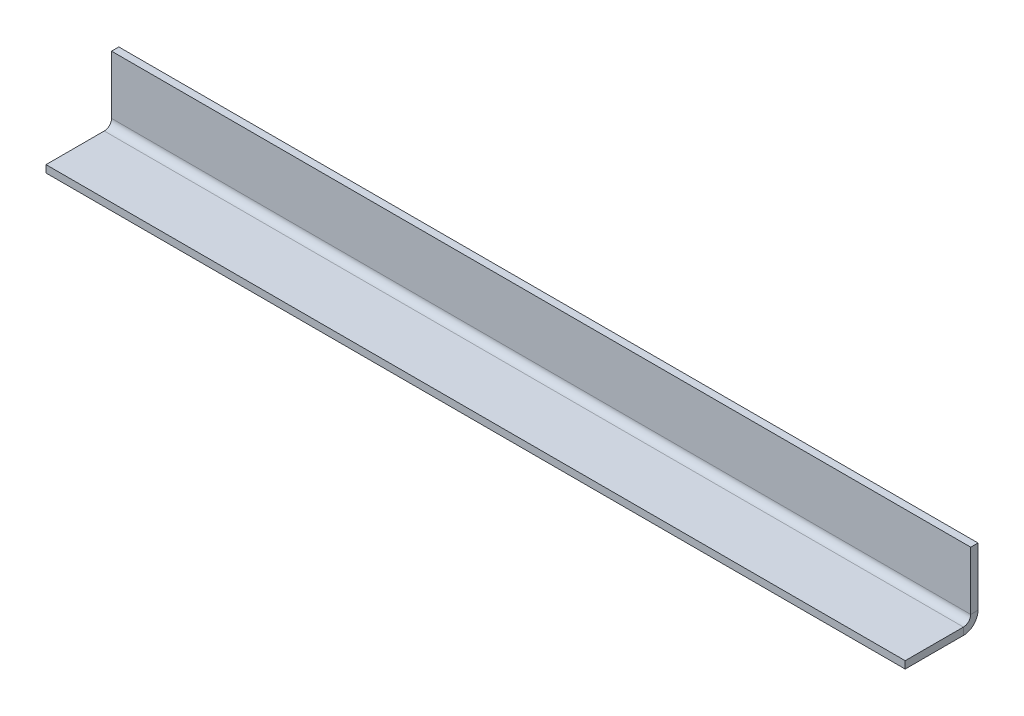
ISO-10303-21;
HEADER;
FILE_DESCRIPTION(('STEP AP214'),'2;1');
FILE_NAME('part.step','',(''),(''),'','','');
FILE_SCHEMA(('AUTOMOTIVE_DESIGN { 1 0 10303 214 1 1 1 1 }'));
ENDSEC;
DATA;
#1=APPLICATION_CONTEXT('core data for automotive mechanical design processes');
#2=APPLICATION_PROTOCOL_DEFINITION('international standard','automotive_design',2000,#1);
#3=PRODUCT_CONTEXT('',#1,'mechanical');
#4=PRODUCT('Part','Part','',(#3));
#5=PRODUCT_RELATED_PRODUCT_CATEGORY('part','',(#4));
#6=PRODUCT_DEFINITION_FORMATION('','',#4);
#7=PRODUCT_DEFINITION_CONTEXT('part definition',#1,'design');
#8=PRODUCT_DEFINITION('design','',#6,#7);
#9=PRODUCT_DEFINITION_SHAPE('','',#8);
#10=(LENGTH_UNIT() NAMED_UNIT(*) SI_UNIT(.MILLI.,.METRE.));
#11=(NAMED_UNIT(*) PLANE_ANGLE_UNIT() SI_UNIT($,.RADIAN.));
#12=(NAMED_UNIT(*) SI_UNIT($,.STERADIAN.) SOLID_ANGLE_UNIT());
#13=UNCERTAINTY_MEASURE_WITH_UNIT(LENGTH_MEASURE(1.E-05),#10,'distance_accuracy_value','');
#14=(GEOMETRIC_REPRESENTATION_CONTEXT(3) GLOBAL_UNCERTAINTY_ASSIGNED_CONTEXT((#13)) GLOBAL_UNIT_ASSIGNED_CONTEXT((#10,
#11,#12)) REPRESENTATION_CONTEXT('',''));
#15=CARTESIAN_POINT('',(0.,0.,0.));
#16=DIRECTION('',(0.,0.,1.));
#17=DIRECTION('',(1.,0.,0.));
#18=AXIS2_PLACEMENT_3D('',#15,#16,#17);
#19=CARTESIAN_POINT('',(374.65,0.,-25.4));
#20=DIRECTION('',(1.,0.,0.));
#21=DIRECTION('',(0.,0.,-1.));
#22=AXIS2_PLACEMENT_3D('',#19,#20,#21);
#23=PLANE('',#22);
#24=DIRECTION('',(0.,1.,0.));
#25=VECTOR('',#24,1.);
#26=CARTESIAN_POINT('',(374.65,0.,-25.4));
#27=LINE('',#26,#25);
#28=CARTESIAN_POINT('',(374.65,0.,-25.4));
#29=VERTEX_POINT('',#28);
#30=CARTESIAN_POINT('',(374.65,3.175,-25.4));
#31=VERTEX_POINT('',#30);
#32=EDGE_CURVE('E11',#29,#31,#27,.T.);
#33=ORIENTED_EDGE('',*,*,#32,.F.);
#34=CARTESIAN_POINT('',(374.65,6.35,-25.4));
#35=DIRECTION('',(-1.,0.,0.));
#36=DIRECTION('',(0.,0.,1.));
#37=AXIS2_PLACEMENT_3D('',#34,#35,#36);
#38=CIRCLE('',#37,6.35);
#39=CARTESIAN_POINT('',(374.65,6.35,-31.75));
#40=VERTEX_POINT('',#39);
#41=EDGE_CURVE('E127',#29,#40,#38,.F.);
#42=ORIENTED_EDGE('',*,*,#41,.T.);
#43=DIRECTION('',(0.,0.,-1.));
#44=VECTOR('',#43,1.);
#45=CARTESIAN_POINT('',(374.65,6.35,-28.575));
#46=LINE('',#45,#44);
#47=CARTESIAN_POINT('',(374.65,6.35,-28.575));
#48=VERTEX_POINT('',#47);
#49=EDGE_CURVE('E45',#48,#40,#46,.T.);
#50=ORIENTED_EDGE('',*,*,#49,.F.);
#51=CARTESIAN_POINT('',(374.65,6.35,-25.4));
#52=DIRECTION('',(1.,0.,0.));
#53=DIRECTION('',(0.,0.,-1.));
#54=AXIS2_PLACEMENT_3D('',#51,#52,#53);
#55=CIRCLE('',#54,3.175);
#56=EDGE_CURVE('E134',#31,#48,#55,.T.);
#57=ORIENTED_EDGE('',*,*,#56,.F.);
#58=EDGE_LOOP('',(#33,#42,#50,#57));
#59=FACE_BOUND('',#58,.T.);
#60=ADVANCED_FACE('F37',(#59),#23,.T.);
#61=CARTESIAN_POINT('',(374.65,6.35,-28.575));
#62=DIRECTION('',(1.,0.,0.));
#63=DIRECTION('',(0.,0.,-1.));
#64=AXIS2_PLACEMENT_3D('',#61,#62,#63);
#65=PLANE('',#64);
#66=DIRECTION('',(0.,0.,-1.));
#67=VECTOR('',#66,1.);
#68=CARTESIAN_POINT('',(374.65,0.,0.));
#69=LINE('',#68,#67);
#70=CARTESIAN_POINT('',(374.65,0.,0.));
#71=VERTEX_POINT('',#70);
#72=EDGE_CURVE('E122',#71,#29,#69,.T.);
#73=ORIENTED_EDGE('',*,*,#72,.T.);
#74=ORIENTED_EDGE('',*,*,#32,.T.);
#75=DIRECTION('',(0.,0.,-1.));
#76=VECTOR('',#75,1.);
#77=CARTESIAN_POINT('',(374.65,3.175,0.));
#78=LINE('',#77,#76);
#79=CARTESIAN_POINT('',(374.65,3.175,0.));
#80=VERTEX_POINT('',#79);
#81=EDGE_CURVE('E132',#80,#31,#78,.T.);
#82=ORIENTED_EDGE('',*,*,#81,.F.);
#83=DIRECTION('',(0.,1.,0.));
#84=VECTOR('',#83,1.);
#85=CARTESIAN_POINT('',(374.65,0.,0.));
#86=LINE('',#85,#84);
#87=EDGE_CURVE('E113',#71,#80,#86,.T.);
#88=ORIENTED_EDGE('',*,*,#87,.F.);
#89=EDGE_LOOP('',(#73,#74,#82,#88));
#90=FACE_BOUND('',#89,.T.);
#91=ADVANCED_FACE('F130',(#90),#65,.T.);
#92=CARTESIAN_POINT('',(0.,6.35,-31.75));
#93=DIRECTION('',(-1.,0.,0.));
#94=DIRECTION('',(0.,0.,1.));
#95=AXIS2_PLACEMENT_3D('',#92,#93,#94);
#96=PLANE('',#95);
#97=DIRECTION('',(0.,0.,1.));
#98=VECTOR('',#97,1.);
#99=CARTESIAN_POINT('',(0.,6.35,-31.75));
#100=LINE('',#99,#98);
#101=CARTESIAN_POINT('',(0.,6.35,-31.75));
#102=VERTEX_POINT('',#101);
#103=CARTESIAN_POINT('',(0.,6.35,-28.575));
#104=VERTEX_POINT('',#103);
#105=EDGE_CURVE('E88',#102,#104,#100,.T.);
#106=ORIENTED_EDGE('',*,*,#105,.F.);
#107=CARTESIAN_POINT('',(0.,6.35,-25.4));
#108=DIRECTION('',(-1.,0.,0.));
#109=DIRECTION('',(0.,0.,1.));
#110=AXIS2_PLACEMENT_3D('',#107,#108,#109);
#111=CIRCLE('',#110,6.35);
#112=CARTESIAN_POINT('',(0.,0.,-25.4));
#113=VERTEX_POINT('',#112);
#114=EDGE_CURVE('E156',#113,#102,#111,.F.);
#115=ORIENTED_EDGE('',*,*,#114,.F.);
#116=DIRECTION('',(0.,-1.,0.));
#117=VECTOR('',#116,1.);
#118=CARTESIAN_POINT('',(0.,3.175,-25.4));
#119=LINE('',#118,#117);
#120=CARTESIAN_POINT('',(0.,3.175,-25.4));
#121=VERTEX_POINT('',#120);
#122=EDGE_CURVE('E81',#121,#113,#119,.T.);
#123=ORIENTED_EDGE('',*,*,#122,.F.);
#124=CARTESIAN_POINT('',(0.,6.35,-25.4));
#125=DIRECTION('',(1.,0.,0.));
#126=DIRECTION('',(0.,0.,-1.));
#127=AXIS2_PLACEMENT_3D('',#124,#125,#126);
#128=CIRCLE('',#127,3.175);
#129=EDGE_CURVE('E149',#121,#104,#128,.T.);
#130=ORIENTED_EDGE('',*,*,#129,.T.);
#131=EDGE_LOOP('',(#106,#115,#123,#130));
#132=FACE_BOUND('',#131,.T.);
#133=ADVANCED_FACE('F188',(#132),#96,.T.);
#134=CARTESIAN_POINT('',(0.,3.175,-25.4));
#135=DIRECTION('',(-1.,0.,0.));
#136=DIRECTION('',(0.,0.,1.));
#137=AXIS2_PLACEMENT_3D('',#134,#135,#136);
#138=PLANE('',#137);
#139=DIRECTION('',(0.,1.,0.));
#140=VECTOR('',#139,1.);
#141=CARTESIAN_POINT('',(0.,0.,-31.75));
#142=LINE('',#141,#140);
#143=CARTESIAN_POINT('',(0.,31.75,-31.75));
#144=VERTEX_POINT('',#143);
#145=EDGE_CURVE('E140',#102,#144,#142,.T.);
#146=ORIENTED_EDGE('',*,*,#145,.F.);
#147=ORIENTED_EDGE('',*,*,#105,.T.);
#148=DIRECTION('',(0.,1.,0.));
#149=VECTOR('',#148,1.);
#150=CARTESIAN_POINT('',(0.,0.,-28.575));
#151=LINE('',#150,#149);
#152=CARTESIAN_POINT('',(0.,31.75,-28.575));
#153=VERTEX_POINT('',#152);
#154=EDGE_CURVE('E146',#104,#153,#151,.T.);
#155=ORIENTED_EDGE('',*,*,#154,.T.);
#156=DIRECTION('',(0.,0.,-1.));
#157=VECTOR('',#156,1.);
#158=CARTESIAN_POINT('',(0.,31.75,-28.575));
#159=LINE('',#158,#157);
#160=EDGE_CURVE('E143',#153,#144,#159,.T.);
#161=ORIENTED_EDGE('',*,*,#160,.T.);
#162=EDGE_LOOP('',(#146,#147,#155,#161));
#163=FACE_BOUND('',#162,.T.);
#164=ADVANCED_FACE('F175',(#163),#138,.T.);
#165=CARTESIAN_POINT('',(374.65,0.,-31.75));
#166=DIRECTION('',(0.,0.,1.));
#167=DIRECTION('',(1.,0.,0.));
#168=AXIS2_PLACEMENT_3D('',#165,#166,#167);
#169=PLANE('',#168);
#170=ORIENTED_EDGE('',*,*,#145,.T.);
#171=DIRECTION('',(-1.,0.,0.));
#172=VECTOR('',#171,1.);
#173=CARTESIAN_POINT('',(374.65,31.75,-31.75));
#174=LINE('',#173,#172);
#175=CARTESIAN_POINT('',(374.65,31.75,-31.75));
#176=VERTEX_POINT('',#175);
#177=EDGE_CURVE('E170',#176,#144,#174,.T.);
#178=ORIENTED_EDGE('',*,*,#177,.F.);
#179=DIRECTION('',(0.,1.,0.));
#180=VECTOR('',#179,1.);
#181=CARTESIAN_POINT('',(374.65,0.,-31.75));
#182=LINE('',#181,#180);
#183=EDGE_CURVE('E94',#40,#176,#182,.T.);
#184=ORIENTED_EDGE('',*,*,#183,.F.);
#185=DIRECTION('',(-1.,0.,0.));
#186=VECTOR('',#185,1.);
#187=CARTESIAN_POINT('',(374.65,6.35,-31.75));
#188=LINE('',#187,#186);
#189=EDGE_CURVE('E139',#40,#102,#188,.T.);
#190=ORIENTED_EDGE('',*,*,#189,.T.);
#191=EDGE_LOOP('',(#170,#178,#184,#190));
#192=FACE_BOUND('',#191,.T.);
#193=ADVANCED_FACE('F224',(#192),#169,.F.);
#194=CARTESIAN_POINT('',(374.65,31.75,-28.575));
#195=DIRECTION('',(0.,1.,0.));
#196=DIRECTION('',(0.,0.,1.));
#197=AXIS2_PLACEMENT_3D('',#194,#195,#196);
#198=PLANE('',#197);
#199=ORIENTED_EDGE('',*,*,#160,.F.);
#200=DIRECTION('',(-1.,0.,0.));
#201=VECTOR('',#200,1.);
#202=CARTESIAN_POINT('',(374.65,31.75,-28.575));
#203=LINE('',#202,#201);
#204=CARTESIAN_POINT('',(374.65,31.75,-28.575));
#205=VERTEX_POINT('',#204);
#206=EDGE_CURVE('E168',#205,#153,#203,.T.);
#207=ORIENTED_EDGE('',*,*,#206,.F.);
#208=DIRECTION('',(0.,0.,-1.));
#209=VECTOR('',#208,1.);
#210=CARTESIAN_POINT('',(374.65,31.75,-28.575));
#211=LINE('',#210,#209);
#212=EDGE_CURVE('E194',#205,#176,#211,.T.);
#213=ORIENTED_EDGE('',*,*,#212,.T.);
#214=ORIENTED_EDGE('',*,*,#177,.T.);
#215=EDGE_LOOP('',(#199,#207,#213,#214));
#216=FACE_BOUND('',#215,.T.);
#217=ADVANCED_FACE('F200',(#216),#198,.T.);
#218=CARTESIAN_POINT('',(374.65,0.,-28.575));
#219=DIRECTION('',(0.,0.,1.));
#220=DIRECTION('',(1.,0.,0.));
#221=AXIS2_PLACEMENT_3D('',#218,#219,#220);
#222=PLANE('',#221);
#223=ORIENTED_EDGE('',*,*,#154,.F.);
#224=DIRECTION('',(-1.,0.,0.));
#225=VECTOR('',#224,1.);
#226=CARTESIAN_POINT('',(374.65,6.35,-28.575));
#227=LINE('',#226,#225);
#228=EDGE_CURVE('E165',#48,#104,#227,.T.);
#229=ORIENTED_EDGE('',*,*,#228,.F.);
#230=DIRECTION('',(0.,1.,0.));
#231=VECTOR('',#230,1.);
#232=CARTESIAN_POINT('',(374.65,0.,-28.575));
#233=LINE('',#232,#231);
#234=EDGE_CURVE('E193',#48,#205,#233,.T.);
#235=ORIENTED_EDGE('',*,*,#234,.T.);
#236=ORIENTED_EDGE('',*,*,#206,.T.);
#237=EDGE_LOOP('',(#223,#229,#235,#236));
#238=FACE_BOUND('',#237,.T.);
#239=ADVANCED_FACE('F186',(#238),#222,.T.);
#240=CARTESIAN_POINT('',(374.65,6.35,-25.4));
#241=DIRECTION('',(-1.,0.,0.));
#242=DIRECTION('',(0.,0.,1.));
#243=AXIS2_PLACEMENT_3D('',#240,#241,#242);
#244=CYLINDRICAL_SURFACE('',#243,3.175);
#245=ORIENTED_EDGE('',*,*,#129,.F.);
#246=DIRECTION('',(-1.,0.,0.));
#247=VECTOR('',#246,1.);
#248=CARTESIAN_POINT('',(374.65,3.175,-25.4));
#249=LINE('',#248,#247);
#250=EDGE_CURVE('E162',#31,#121,#249,.T.);
#251=ORIENTED_EDGE('',*,*,#250,.F.);
#252=ORIENTED_EDGE('',*,*,#56,.T.);
#253=ORIENTED_EDGE('',*,*,#228,.T.);
#254=EDGE_LOOP('',(#245,#251,#252,#253));
#255=FACE_BOUND('',#254,.T.);
#256=ADVANCED_FACE('F181',(#255),#244,.F.);
#257=CARTESIAN_POINT('',(374.65,3.175,0.));
#258=DIRECTION('',(0.,1.,0.));
#259=DIRECTION('',(0.,0.,1.));
#260=AXIS2_PLACEMENT_3D('',#257,#258,#259);
#261=PLANE('',#260);
#262=DIRECTION('',(0.,0.,-1.));
#263=VECTOR('',#262,1.);
#264=CARTESIAN_POINT('',(0.,3.175,0.));
#265=LINE('',#264,#263);
#266=CARTESIAN_POINT('',(0.,3.175,0.));
#267=VERTEX_POINT('',#266);
#268=EDGE_CURVE('E151',#267,#121,#265,.T.);
#269=ORIENTED_EDGE('',*,*,#268,.F.);
#270=DIRECTION('',(-1.,0.,0.));
#271=VECTOR('',#270,1.);
#272=CARTESIAN_POINT('',(374.65,3.175,0.));
#273=LINE('',#272,#271);
#274=EDGE_CURVE('E117',#80,#267,#273,.T.);
#275=ORIENTED_EDGE('',*,*,#274,.F.);
#276=ORIENTED_EDGE('',*,*,#81,.T.);
#277=ORIENTED_EDGE('',*,*,#250,.T.);
#278=EDGE_LOOP('',(#269,#275,#276,#277));
#279=FACE_BOUND('',#278,.T.);
#280=ADVANCED_FACE('F191',(#279),#261,.T.);
#281=CARTESIAN_POINT('',(374.65,0.,0.));
#282=DIRECTION('',(0.,0.,1.));
#283=DIRECTION('',(1.,0.,0.));
#284=AXIS2_PLACEMENT_3D('',#281,#282,#283);
#285=PLANE('',#284);
#286=DIRECTION('',(0.,1.,0.));
#287=VECTOR('',#286,1.);
#288=CARTESIAN_POINT('',(0.,0.,0.));
#289=LINE('',#288,#287);
#290=CARTESIAN_POINT('',(0.,0.,0.));
#291=VERTEX_POINT('',#290);
#292=EDGE_CURVE('E115',#291,#267,#289,.T.);
#293=ORIENTED_EDGE('',*,*,#292,.F.);
#294=DIRECTION('',(-1.,0.,0.));
#295=VECTOR('',#294,1.);
#296=CARTESIAN_POINT('',(374.65,0.,0.));
#297=LINE('',#296,#295);
#298=EDGE_CURVE('E109',#71,#291,#297,.T.);
#299=ORIENTED_EDGE('',*,*,#298,.F.);
#300=ORIENTED_EDGE('',*,*,#87,.T.);
#301=ORIENTED_EDGE('',*,*,#274,.T.);
#302=EDGE_LOOP('',(#293,#299,#300,#301));
#303=FACE_BOUND('',#302,.T.);
#304=ADVANCED_FACE('F111',(#303),#285,.T.);
#305=CARTESIAN_POINT('',(374.65,0.,0.));
#306=DIRECTION('',(0.,1.,0.));
#307=DIRECTION('',(0.,0.,1.));
#308=AXIS2_PLACEMENT_3D('',#305,#306,#307);
#309=PLANE('',#308);
#310=DIRECTION('',(0.,0.,-1.));
#311=VECTOR('',#310,1.);
#312=CARTESIAN_POINT('',(0.,0.,0.));
#313=LINE('',#312,#311);
#314=EDGE_CURVE('E154',#291,#113,#313,.T.);
#315=ORIENTED_EDGE('',*,*,#314,.T.);
#316=DIRECTION('',(-1.,0.,0.));
#317=VECTOR('',#316,1.);
#318=CARTESIAN_POINT('',(374.65,0.,-25.4));
#319=LINE('',#318,#317);
#320=EDGE_CURVE('E118',#29,#113,#319,.T.);
#321=ORIENTED_EDGE('',*,*,#320,.F.);
#322=ORIENTED_EDGE('',*,*,#72,.F.);
#323=ORIENTED_EDGE('',*,*,#298,.T.);
#324=EDGE_LOOP('',(#315,#321,#322,#323));
#325=FACE_BOUND('',#324,.T.);
#326=ADVANCED_FACE('F123',(#325),#309,.F.);
#327=CARTESIAN_POINT('',(374.65,6.35,-25.4));
#328=DIRECTION('',(-1.,0.,0.));
#329=DIRECTION('',(0.,0.,1.));
#330=AXIS2_PLACEMENT_3D('',#327,#328,#329);
#331=CYLINDRICAL_SURFACE('',#330,6.35);
#332=ORIENTED_EDGE('',*,*,#114,.T.);
#333=ORIENTED_EDGE('',*,*,#189,.F.);
#334=ORIENTED_EDGE('',*,*,#41,.F.);
#335=ORIENTED_EDGE('',*,*,#320,.T.);
#336=EDGE_LOOP('',(#332,#333,#334,#335));
#337=FACE_BOUND('',#336,.T.);
#338=ADVANCED_FACE('F204',(#337),#331,.T.);
#339=CARTESIAN_POINT('',(374.65,6.35,-25.4));
#340=DIRECTION('',(1.,0.,0.));
#341=DIRECTION('',(0.,0.,-1.));
#342=AXIS2_PLACEMENT_3D('',#339,#340,#341);
#343=PLANE('',#342);
#344=ORIENTED_EDGE('',*,*,#183,.T.);
#345=ORIENTED_EDGE('',*,*,#212,.F.);
#346=ORIENTED_EDGE('',*,*,#234,.F.);
#347=ORIENTED_EDGE('',*,*,#49,.T.);
#348=EDGE_LOOP('',(#344,#345,#346,#347));
#349=FACE_BOUND('',#348,.T.);
#350=ADVANCED_FACE('F201',(#349),#343,.T.);
#351=CARTESIAN_POINT('',(0.,6.35,-25.4));
#352=DIRECTION('',(1.,0.,0.));
#353=DIRECTION('',(0.,0.,-1.));
#354=AXIS2_PLACEMENT_3D('',#351,#352,#353);
#355=PLANE('',#354);
#356=ORIENTED_EDGE('',*,*,#268,.T.);
#357=ORIENTED_EDGE('',*,*,#122,.T.);
#358=ORIENTED_EDGE('',*,*,#314,.F.);
#359=ORIENTED_EDGE('',*,*,#292,.T.);
#360=EDGE_LOOP('',(#356,#357,#358,#359));
#361=FACE_BOUND('',#360,.T.);
#362=ADVANCED_FACE('F203',(#361),#355,.F.);
#363=CLOSED_SHELL('',(#60,#91,#133,#164,#193,#217,#239,#256,#280,#304,#326,#338,#350,#362));
#364=MANIFOLD_SOLID_BREP('B2',#363);
#365=ADVANCED_BREP_SHAPE_REPRESENTATION('',(#18,#364),#14);
#366=SHAPE_DEFINITION_REPRESENTATION(#9,#365);
ENDSEC;
END-ISO-10303-21;
